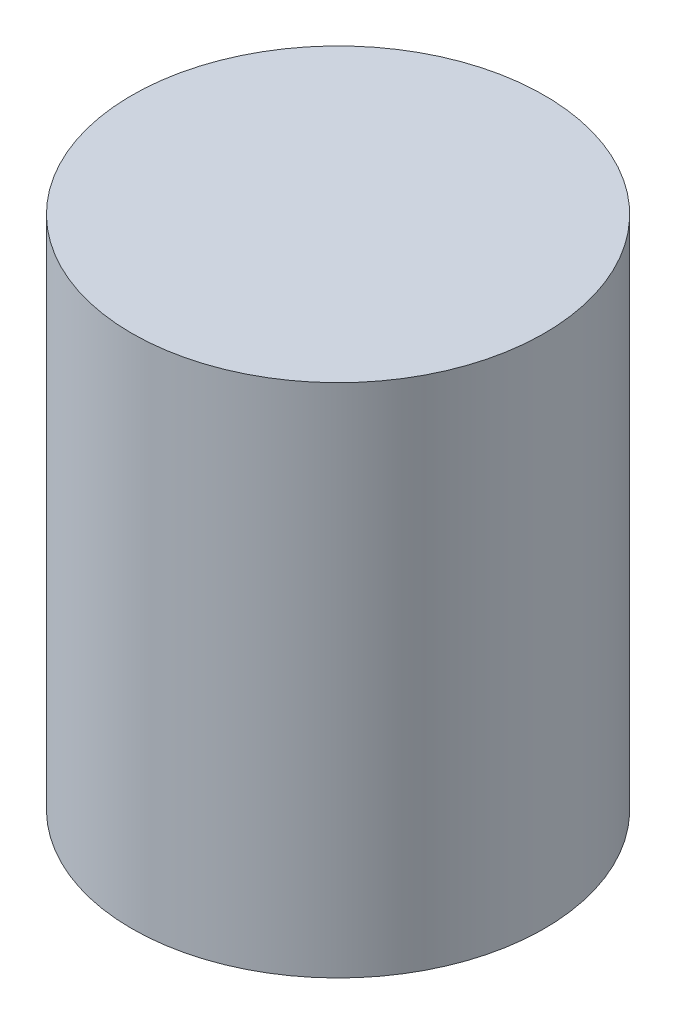
ISO-10303-21;
HEADER;
FILE_DESCRIPTION(('STEP AP214'),'2;1');
FILE_NAME('part.step','',(''),(''),'','','');
FILE_SCHEMA(('AUTOMOTIVE_DESIGN { 1 0 10303 214 1 1 1 1 }'));
ENDSEC;
DATA;
#1=APPLICATION_CONTEXT('core data for automotive mechanical design processes');
#2=APPLICATION_PROTOCOL_DEFINITION('international standard','automotive_design',2000,#1);
#3=PRODUCT_CONTEXT('',#1,'mechanical');
#4=PRODUCT('Part','Part','',(#3));
#5=PRODUCT_RELATED_PRODUCT_CATEGORY('part','',(#4));
#6=PRODUCT_DEFINITION_FORMATION('','',#4);
#7=PRODUCT_DEFINITION_CONTEXT('part definition',#1,'design');
#8=PRODUCT_DEFINITION('design','',#6,#7);
#9=PRODUCT_DEFINITION_SHAPE('','',#8);
#10=(LENGTH_UNIT() NAMED_UNIT(*) SI_UNIT(.MILLI.,.METRE.));
#11=(NAMED_UNIT(*) PLANE_ANGLE_UNIT() SI_UNIT($,.RADIAN.));
#12=(NAMED_UNIT(*) SI_UNIT($,.STERADIAN.) SOLID_ANGLE_UNIT());
#13=UNCERTAINTY_MEASURE_WITH_UNIT(LENGTH_MEASURE(1.E-05),#10,'distance_accuracy_value','');
#14=(GEOMETRIC_REPRESENTATION_CONTEXT(3) GLOBAL_UNCERTAINTY_ASSIGNED_CONTEXT((#13)) GLOBAL_UNIT_ASSIGNED_CONTEXT((#10,
#11,#12)) REPRESENTATION_CONTEXT('',''));
#15=CARTESIAN_POINT('',(0.,0.,0.));
#16=DIRECTION('',(0.,0.,1.));
#17=DIRECTION('',(1.,0.,0.));
#18=AXIS2_PLACEMENT_3D('',#15,#16,#17);
#19=CARTESIAN_POINT('',(0.,500.,0.));
#20=DIRECTION('',(0.,-1.,0.));
#21=DIRECTION('',(0.,0.,-1.));
#22=AXIS2_PLACEMENT_3D('',#19,#20,#21);
#23=CYLINDRICAL_SURFACE('',#22,200.);
#24=CARTESIAN_POINT('',(0.,500.,0.));
#25=DIRECTION('',(0.,1.,0.));
#26=DIRECTION('',(0.,0.,1.));
#27=AXIS2_PLACEMENT_3D('',#24,#25,#26);
#28=CIRCLE('',#27,200.);
#29=CARTESIAN_POINT('',(0.,500.,200.));
#30=VERTEX_POINT('',#29);
#31=EDGE_CURVE('E10',#30,#30,#28,.T.);
#32=ORIENTED_EDGE('',*,*,#31,.F.);
#33=EDGE_LOOP('',(#32));
#34=FACE_BOUND('',#33,.T.);
#35=CARTESIAN_POINT('',(0.,0.,0.));
#36=DIRECTION('',(0.,1.,0.));
#37=DIRECTION('',(0.,0.,1.));
#38=AXIS2_PLACEMENT_3D('',#35,#36,#37);
#39=CIRCLE('',#38,200.);
#40=CARTESIAN_POINT('',(0.,0.,200.));
#41=VERTEX_POINT('',#40);
#42=EDGE_CURVE('E37',#41,#41,#39,.T.);
#43=ORIENTED_EDGE('',*,*,#42,.T.);
#44=EDGE_LOOP('',(#43));
#45=FACE_BOUND('',#44,.T.);
#46=ADVANCED_FACE('F34',(#34,#45),#23,.T.);
#47=CARTESIAN_POINT('',(0.,500.,0.));
#48=DIRECTION('',(0.,1.,0.));
#49=DIRECTION('',(0.,0.,1.));
#50=AXIS2_PLACEMENT_3D('',#47,#48,#49);
#51=PLANE('',#50);
#52=ORIENTED_EDGE('',*,*,#31,.T.);
#53=EDGE_LOOP('',(#52));
#54=FACE_BOUND('',#53,.T.);
#55=ADVANCED_FACE('F49',(#54),#51,.T.);
#56=CARTESIAN_POINT('',(0.,0.,0.));
#57=DIRECTION('',(0.,1.,0.));
#58=DIRECTION('',(0.,0.,1.));
#59=AXIS2_PLACEMENT_3D('',#56,#57,#58);
#60=PLANE('',#59);
#61=ORIENTED_EDGE('',*,*,#42,.F.);
#62=EDGE_LOOP('',(#61));
#63=FACE_BOUND('',#62,.T.);
#64=ADVANCED_FACE('F47',(#63),#60,.F.);
#65=CLOSED_SHELL('',(#46,#55,#64));
#66=MANIFOLD_SOLID_BREP('B2',#65);
#67=ADVANCED_BREP_SHAPE_REPRESENTATION('',(#18,#66),#14);
#68=SHAPE_DEFINITION_REPRESENTATION(#9,#67);
ENDSEC;
END-ISO-10303-21;
